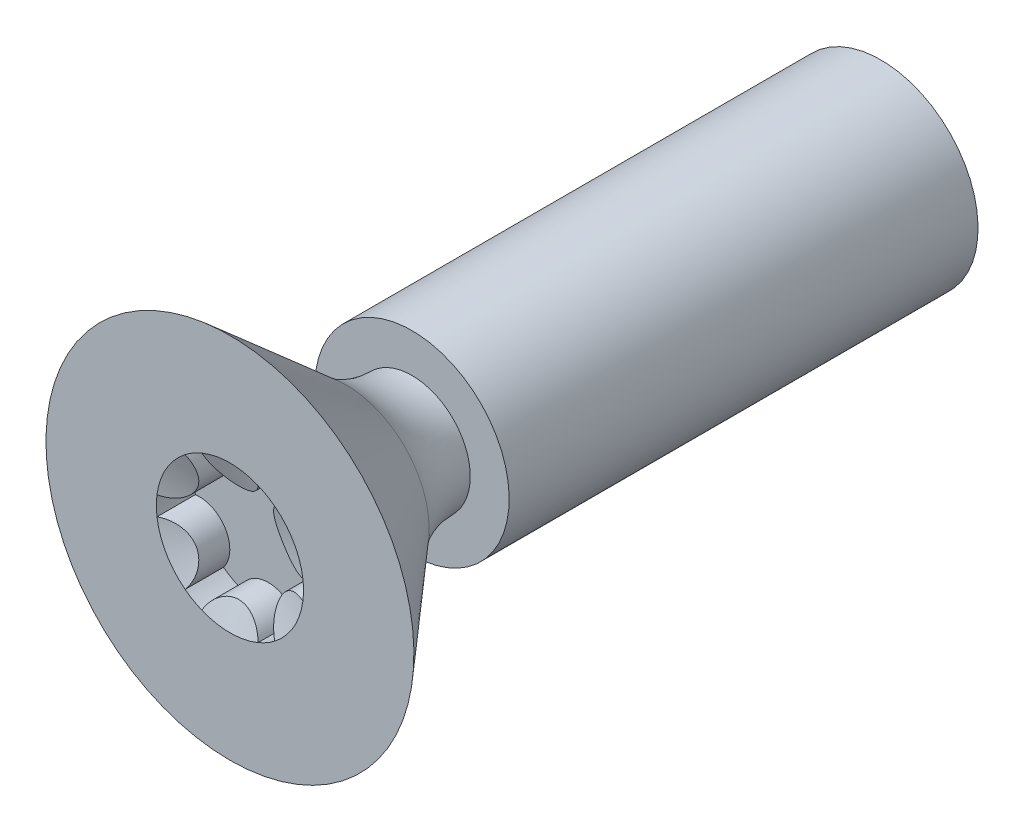
ISO-10303-21;
HEADER;
FILE_DESCRIPTION(('STEP AP214'),'2;1');
FILE_NAME('part.step','',(''),(''),'','','');
FILE_SCHEMA(('AUTOMOTIVE_DESIGN { 1 0 10303 214 1 1 1 1 }'));
ENDSEC;
DATA;
#1=APPLICATION_CONTEXT('core data for automotive mechanical design processes');
#2=APPLICATION_PROTOCOL_DEFINITION('international standard','automotive_design',2000,#1);
#3=PRODUCT_CONTEXT('',#1,'mechanical');
#4=PRODUCT('Part','Part','',(#3));
#5=PRODUCT_RELATED_PRODUCT_CATEGORY('part','',(#4));
#6=PRODUCT_DEFINITION_FORMATION('','',#4);
#7=PRODUCT_DEFINITION_CONTEXT('part definition',#1,'design');
#8=PRODUCT_DEFINITION('design','',#6,#7);
#9=PRODUCT_DEFINITION_SHAPE('','',#8);
#10=(LENGTH_UNIT() NAMED_UNIT(*) SI_UNIT(.MILLI.,.METRE.));
#11=(NAMED_UNIT(*) PLANE_ANGLE_UNIT() SI_UNIT($,.RADIAN.));
#12=(NAMED_UNIT(*) SI_UNIT($,.STERADIAN.) SOLID_ANGLE_UNIT());
#13=UNCERTAINTY_MEASURE_WITH_UNIT(LENGTH_MEASURE(1.E-05),#10,'distance_accuracy_value','');
#14=(GEOMETRIC_REPRESENTATION_CONTEXT(3) GLOBAL_UNCERTAINTY_ASSIGNED_CONTEXT((#13)) GLOBAL_UNIT_ASSIGNED_CONTEXT((#10,
#11,#12)) REPRESENTATION_CONTEXT('',''));
#15=CARTESIAN_POINT('',(0.,0.,0.));
#16=DIRECTION('',(0.,0.,1.));
#17=DIRECTION('',(1.,0.,0.));
#18=AXIS2_PLACEMENT_3D('',#15,#16,#17);
#19=CARTESIAN_POINT('',(0.,0.,-4.7625));
#20=DIRECTION('',(0.,0.,1.));
#21=DIRECTION('',(0.,-1.,0.));
#22=AXIS2_PLACEMENT_3D('',#19,#20,#21);
#23=PLANE('',#22);
#24=CARTESIAN_POINT('',(0.,0.,-4.7625));
#25=DIRECTION('',(0.,0.,1.));
#26=DIRECTION('',(0.,-1.,0.));
#27=AXIS2_PLACEMENT_3D('',#24,#25,#26);
#28=CIRCLE('',#27,1.4224);
#29=CARTESIAN_POINT('',(0.,-1.4224,-4.7625));
#30=VERTEX_POINT('',#29);
#31=EDGE_CURVE('E55',#30,#30,#28,.T.);
#32=ORIENTED_EDGE('',*,*,#31,.F.);
#33=EDGE_LOOP('',(#32));
#34=FACE_BOUND('',#33,.T.);
#35=ADVANCED_FACE('F41',(#34),#23,.F.);
#36=CARTESIAN_POINT('',(0.,0.,4.7625));
#37=DIRECTION('',(0.,0.,1.));
#38=DIRECTION('',(0.,-1.,0.));
#39=AXIS2_PLACEMENT_3D('',#36,#37,#38);
#40=CYLINDRICAL_SURFACE('',#39,1.4224);
#41=CARTESIAN_POINT('',(0.,0.,2.09888516960932));
#42=DIRECTION('',(0.,0.,1.));
#43=DIRECTION('',(0.,-1.,0.));
#44=AXIS2_PLACEMENT_3D('',#41,#42,#43);
#45=CIRCLE('',#44,1.4224);
#46=CARTESIAN_POINT('',(0.,-1.4224,2.09888516960932));
#47=VERTEX_POINT('',#46);
#48=EDGE_CURVE('E203',#47,#47,#45,.T.);
#49=ORIENTED_EDGE('',*,*,#48,.F.);
#50=EDGE_LOOP('',(#49));
#51=FACE_BOUND('',#50,.T.);
#52=ORIENTED_EDGE('',*,*,#31,.T.);
#53=EDGE_LOOP('',(#52));
#54=FACE_BOUND('',#53,.T.);
#55=ADVANCED_FACE('F208',(#51,#54),#40,.T.);
#56=CARTESIAN_POINT('',(0.,1.4224,2.09888516960932));
#57=DIRECTION('',(0.,0.,-1.));
#58=DIRECTION('',(0.,1.,0.));
#59=AXIS2_PLACEMENT_3D('',#56,#57,#58);
#60=PLANE('',#59);
#61=CARTESIAN_POINT('',(0.,0.,2.09888516960932));
#62=DIRECTION('',(0.,0.,1.));
#63=DIRECTION('',(0.,-1.,0.));
#64=AXIS2_PLACEMENT_3D('',#61,#62,#63);
#65=CIRCLE('',#64,0.853440000000002);
#66=CARTESIAN_POINT('',(0.,-0.853440000000003,2.09888516960932));
#67=VERTEX_POINT('',#66);
#68=EDGE_CURVE('E200',#67,#67,#65,.T.);
#69=ORIENTED_EDGE('',*,*,#68,.F.);
#70=EDGE_LOOP('',(#69));
#71=FACE_BOUND('',#70,.T.);
#72=ORIENTED_EDGE('',*,*,#48,.T.);
#73=EDGE_LOOP('',(#72));
#74=FACE_BOUND('',#73,.T.);
#75=ADVANCED_FACE('F214',(#71,#74),#60,.F.);
#76=CARTESIAN_POINT('',(0.,0.,2.09888516960932));
#77=DIRECTION('',(0.,0.,1.));
#78=DIRECTION('',(0.,-1.,0.));
#79=AXIS2_PLACEMENT_3D('',#76,#77,#78);
#80=TOROIDAL_SURFACE('',#79,2.31948922406243,1.46604922406243);
#81=CARTESIAN_POINT('',(0.,0.,3.0607));
#82=DIRECTION('',(0.,0.,1.));
#83=DIRECTION('',(0.,-1.,0.));
#84=AXIS2_PLACEMENT_3D('',#81,#82,#83);
#85=CIRCLE('',#84,1.21304782958435);
#86=CARTESIAN_POINT('',(0.,-1.21304782958435,3.0607));
#87=VERTEX_POINT('',#86);
#88=EDGE_CURVE('E197',#87,#87,#85,.T.);
#89=ORIENTED_EDGE('',*,*,#88,.F.);
#90=EDGE_LOOP('',(#89));
#91=FACE_BOUND('',#90,.T.);
#92=ORIENTED_EDGE('',*,*,#68,.T.);
#93=EDGE_LOOP('',(#92));
#94=FACE_BOUND('',#93,.T.);
#95=ADVANCED_FACE('F219',(#91,#94),#80,.F.);
#96=CARTESIAN_POINT('',(0.,0.,3.0607));
#97=DIRECTION('',(0.,0.,1.));
#98=DIRECTION('',(0.,-1.,0.));
#99=AXIS2_PLACEMENT_3D('',#96,#97,#98);
#100=CONICAL_SURFACE('',#99,1.21304782958435,0.715584993317673);
#101=CARTESIAN_POINT('',(0.,0.,4.7625));
#102=DIRECTION('',(0.,0.,1.));
#103=DIRECTION('',(0.,-1.,0.));
#104=AXIS2_PLACEMENT_3D('',#101,#102,#103);
#105=CIRCLE('',#104,2.6924);
#106=CARTESIAN_POINT('',(0.,-2.6924,4.7625));
#107=VERTEX_POINT('',#106);
#108=EDGE_CURVE('E192',#107,#107,#105,.T.);
#109=ORIENTED_EDGE('',*,*,#108,.F.);
#110=EDGE_LOOP('',(#109));
#111=FACE_BOUND('',#110,.T.);
#112=ORIENTED_EDGE('',*,*,#88,.T.);
#113=EDGE_LOOP('',(#112));
#114=FACE_BOUND('',#113,.T.);
#115=ADVANCED_FACE('F226',(#111,#114),#100,.T.);
#116=CARTESIAN_POINT('',(0.,2.6924,4.7625));
#117=DIRECTION('',(0.,0.,-1.));
#118=DIRECTION('',(0.,1.,0.));
#119=AXIS2_PLACEMENT_3D('',#116,#117,#118);
#120=PLANE('',#119);
#121=CARTESIAN_POINT('',(0.,0.,4.7625));
#122=DIRECTION('',(0.,0.,1.));
#123=DIRECTION('',(1.,0.,0.));
#124=AXIS2_PLACEMENT_3D('',#121,#122,#123);
#125=CIRCLE('',#124,1.07696);
#126=CARTESIAN_POINT('',(0.655611708585233,0.854409813360048,4.7625));
#127=VERTEX_POINT('',#126);
#128=CARTESIAN_POINT('',(0.412134749319907,0.994981301333356,4.7625));
#129=VERTEX_POINT('',#128);
#130=EDGE_CURVE('E151',#127,#129,#125,.T.);
#131=ORIENTED_EDGE('',*,*,#130,.F.);
#132=CARTESIAN_POINT('',(0.,0.,4.7625));
#133=DIRECTION('',(0.,0.,1.));
#134=DIRECTION('',(1.,0.,0.));
#135=AXIS2_PLACEMENT_3D('',#132,#133,#134);
#136=CIRCLE('',#135,1.07696);
#137=CARTESIAN_POINT('',(1.06774645790514,0.140571487973304,4.7625));
#138=VERTEX_POINT('',#137);
#139=EDGE_CURVE('E134',#138,#127,#136,.T.);
#140=ORIENTED_EDGE('',*,*,#139,.F.);
#141=CARTESIAN_POINT('',(0.,0.,4.7625));
#142=DIRECTION('',(0.,0.,1.));
#143=DIRECTION('',(0.499999999999998,-0.86602540378444,0.));
#144=AXIS2_PLACEMENT_3D('',#141,#142,#143);
#145=CIRCLE('',#144,1.07696);
#146=CARTESIAN_POINT('',(1.06774645790514,-0.140571487973311,4.7625));
#147=VERTEX_POINT('',#146);
#148=EDGE_CURVE('E148',#147,#138,#145,.T.);
#149=ORIENTED_EDGE('',*,*,#148,.F.);
#150=CARTESIAN_POINT('',(0.655611708585228,-0.854409813360052,4.7625));
#151=VERTEX_POINT('',#150);
#152=EDGE_CURVE('E156',#151,#147,#136,.T.);
#153=ORIENTED_EDGE('',*,*,#152,.F.);
#154=CARTESIAN_POINT('',(0.,0.,4.7625));
#155=DIRECTION('',(0.,0.,1.));
#156=DIRECTION('',(-0.500000000000004,-0.866025403784436,0.));
#157=AXIS2_PLACEMENT_3D('',#154,#155,#156);
#158=CIRCLE('',#157,1.07696);
#159=CARTESIAN_POINT('',(0.412134749319908,-0.994981301333355,4.7625));
#160=VERTEX_POINT('',#159);
#161=EDGE_CURVE('E318',#160,#151,#158,.T.);
#162=ORIENTED_EDGE('',*,*,#161,.F.);
#163=CARTESIAN_POINT('',(-0.412134749319907,-0.994981301333356,4.7625));
#164=VERTEX_POINT('',#163);
#165=EDGE_CURVE('E319',#164,#160,#136,.T.);
#166=ORIENTED_EDGE('',*,*,#165,.F.);
#167=CARTESIAN_POINT('',(0.,0.,4.7625));
#168=DIRECTION('',(0.,0.,1.));
#169=DIRECTION('',(-1.,0.,0.));
#170=AXIS2_PLACEMENT_3D('',#167,#168,#169);
#171=CIRCLE('',#170,1.07696);
#172=CARTESIAN_POINT('',(-0.655611708585239,-0.854409813360043,4.7625));
#173=VERTEX_POINT('',#172);
#174=EDGE_CURVE('E353',#173,#164,#171,.T.);
#175=ORIENTED_EDGE('',*,*,#174,.F.);
#176=CARTESIAN_POINT('',(-1.06774645790514,-0.140571487973297,4.7625));
#177=VERTEX_POINT('',#176);
#178=EDGE_CURVE('E320',#177,#173,#136,.T.);
#179=ORIENTED_EDGE('',*,*,#178,.F.);
#180=CARTESIAN_POINT('',(0.,0.,4.7625));
#181=DIRECTION('',(0.,0.,1.));
#182=DIRECTION('',(-0.499999999999992,0.866025403784443,0.));
#183=AXIS2_PLACEMENT_3D('',#180,#181,#182);
#184=CIRCLE('',#183,1.07696);
#185=CARTESIAN_POINT('',(-1.06774645790514,0.140571487973318,4.7625));
#186=VERTEX_POINT('',#185);
#187=EDGE_CURVE('E336',#186,#177,#184,.T.);
#188=ORIENTED_EDGE('',*,*,#187,.F.);
#189=CARTESIAN_POINT('',(-0.655611708585222,0.854409813360056,4.7625));
#190=VERTEX_POINT('',#189);
#191=EDGE_CURVE('E323',#190,#186,#136,.T.);
#192=ORIENTED_EDGE('',*,*,#191,.F.);
#193=CARTESIAN_POINT('',(0.,0.,4.7625));
#194=DIRECTION('',(0.,0.,1.));
#195=DIRECTION('',(1.,0.,0.));
#196=AXIS2_PLACEMENT_3D('',#193,#194,#195);
#197=CIRCLE('',#196,1.07696);
#198=CARTESIAN_POINT('',(-0.412134749319908,0.994981301333355,4.7625));
#199=VERTEX_POINT('',#198);
#200=EDGE_CURVE('E182',#199,#190,#197,.T.);
#201=ORIENTED_EDGE('',*,*,#200,.F.);
#202=EDGE_CURVE('E154',#129,#199,#136,.T.);
#203=ORIENTED_EDGE('',*,*,#202,.F.);
#204=EDGE_LOOP('',(#131,#140,#149,#153,#162,#166,#175,#179,#188,#192,#201,#203));
#205=FACE_BOUND('',#204,.T.);
#206=ORIENTED_EDGE('',*,*,#108,.T.);
#207=EDGE_LOOP('',(#206));
#208=FACE_BOUND('',#207,.T.);
#209=ADVANCED_FACE('F144',(#205,#208),#120,.F.);
#210=CARTESIAN_POINT('',(0.,0.,4.200906));
#211=DIRECTION('',(0.,0.,1.));
#212=DIRECTION('',(1.,0.,0.));
#213=AXIS2_PLACEMENT_3D('',#210,#211,#212);
#214=CYLINDRICAL_SURFACE('',#213,1.07696);
#215=ORIENTED_EDGE('',*,*,#200,.T.);
#216=DIRECTION('',(0.,0.,1.));
#217=VECTOR('',#216,1.);
#218=CARTESIAN_POINT('',(-0.655611708585222,0.854409813360056,4.200906));
#219=LINE('',#218,#217);
#220=CARTESIAN_POINT('',(-0.655611708585222,0.854409813360056,4.200906));
#221=VERTEX_POINT('',#220);
#222=EDGE_CURVE('E347',#221,#190,#219,.T.);
#223=ORIENTED_EDGE('',*,*,#222,.F.);
#224=CARTESIAN_POINT('',(0.,0.,4.200906));
#225=DIRECTION('',(0.,0.,1.));
#226=DIRECTION('',(1.,0.,0.));
#227=AXIS2_PLACEMENT_3D('',#224,#225,#226);
#228=CIRCLE('',#227,1.07696);
#229=CARTESIAN_POINT('',(-0.412134749319908,0.994981301333355,4.200906));
#230=VERTEX_POINT('',#229);
#231=EDGE_CURVE('E185',#230,#221,#228,.T.);
#232=ORIENTED_EDGE('',*,*,#231,.F.);
#233=DIRECTION('',(0.,0.,1.));
#234=VECTOR('',#233,1.);
#235=CARTESIAN_POINT('',(-0.412134749319908,0.994981301333355,4.200906));
#236=LINE('',#235,#234);
#237=EDGE_CURVE('E62',#230,#199,#236,.T.);
#238=ORIENTED_EDGE('',*,*,#237,.T.);
#239=EDGE_LOOP('',(#215,#223,#232,#238));
#240=FACE_BOUND('',#239,.T.);
#241=ADVANCED_FACE('F233',(#240),#214,.F.);
#242=CARTESIAN_POINT('',(0.,1.1656931040269,4.200906));
#243=DIRECTION('',(0.,0.,1.));
#244=DIRECTION('',(1.,0.,0.));
#245=AXIS2_PLACEMENT_3D('',#242,#243,#244);
#246=CYLINDRICAL_SURFACE('',#245,0.446091438133329);
#247=DIRECTION('',(0.,0.,1.));
#248=VECTOR('',#247,1.);
#249=CARTESIAN_POINT('',(0.412134749319907,0.994981301333355,4.200906));
#250=LINE('',#249,#248);
#251=CARTESIAN_POINT('',(0.412134749319907,0.994981301333355,4.200906));
#252=VERTEX_POINT('',#251);
#253=EDGE_CURVE('E187',#252,#129,#250,.T.);
#254=ORIENTED_EDGE('',*,*,#253,.T.);
#255=CARTESIAN_POINT('',(0.412217535189932,0.995181301333363,4.76257878379122));
#256=CARTESIAN_POINT('',(0.402218532584292,0.970978856009884,4.75306377677122));
#257=CARTESIAN_POINT('',(0.390069787174501,0.947669824303697,4.74351891366794));
#258=CARTESIAN_POINT('',(0.361780712977006,0.903392429802186,4.72470411475033));
#259=CARTESIAN_POINT('',(0.345629774957911,0.882430506814702,4.71543498421686));
#260=CARTESIAN_POINT('',(0.309679984041634,0.843514203319636,4.69755045217848));
#261=CARTESIAN_POINT('',(0.289876786592517,0.82556345383982,4.68893584668143));
#262=CARTESIAN_POINT('',(0.247080771537108,0.793315302332872,4.67289120388156));
#263=CARTESIAN_POINT('',(0.224090675265836,0.779014812594221,4.66546016742611));
#264=CARTESIAN_POINT('',(0.176713064753171,0.755283841482144,4.65275566684374));
#265=CARTESIAN_POINT('',(0.152456468355724,0.745642319957259,4.64739154992137));
#266=CARTESIAN_POINT('',(0.102273448420043,0.730698298567651,4.63892957349096));
#267=CARTESIAN_POINT('',(0.0763492624458178,0.725390110068896,4.63582874339494));
#268=CARTESIAN_POINT('',(0.0270471068895947,0.719818940453361,4.63256478463054));
#269=CARTESIAN_POINT('',(0.00375046947984284,0.71901346298047,4.6320859263302));
#270=CARTESIAN_POINT('',(-0.0426261801452408,0.721037250446202,4.6332778592215));
#271=CARTESIAN_POINT('',(-0.0657062300058927,0.723865871493425,4.63494826960471));
#272=CARTESIAN_POINT('',(-0.109487556319788,0.732706386386486,4.64005874354336));
#273=CARTESIAN_POINT('',(-0.130246890731964,0.738505190424075,4.64337995243548));
#274=CARTESIAN_POINT('',(-0.170477358946198,0.752907678496629,4.65141229574263));
#275=CARTESIAN_POINT('',(-0.189948239915114,0.761511911088823,4.65612370197164));
#276=CARTESIAN_POINT('',(-0.228759760915408,0.782043850090003,4.66702461342053));
#277=CARTESIAN_POINT('',(-0.247962722776532,0.794183940675942,4.67330279790926));
#278=CARTESIAN_POINT('',(-0.284136023529871,0.821058978826113,4.68671274588709));
#279=CARTESIAN_POINT('',(-0.301104417812656,0.835796160747644,4.69384524266095));
#280=CARTESIAN_POINT('',(-0.334388855623221,0.869374807430502,4.70952366364388));
#281=CARTESIAN_POINT('',(-0.350391677575767,0.88849537385316,4.71813706078043));
#282=CARTESIAN_POINT('',(-0.378924549806628,0.928995777520554,4.73568513890219));
#283=CARTESIAN_POINT('',(-0.391460272419411,0.950371844535248,4.74461926776797));
#284=CARTESIAN_POINT('',(-0.405706120214104,0.980035972287522,4.75657927085055));
#285=CARTESIAN_POINT('',(-0.409068533600499,0.98756633153689,4.75958004824173));
#286=CARTESIAN_POINT('',(-0.412217535189934,0.995181301333363,4.76257878379122));
#287=B_SPLINE_CURVE_WITH_KNOTS('',3,(#255,#256,#257,#258,#259,#260,#261,#262,#263,#264,#265,
#266,#267,#268,#269,#270,#271,#272,#273,#274,#275,#276,#277,#278,#279,#280,#281,#282,#283,#284,
#285,#286),.UNSPECIFIED.,.F.,.F.,(4,2,2,2,2,2,2,2,2,2,2,2,2,2,2,4),(0.,0.0835011768916914,
0.167226116630064,0.251051301543926,0.33480534297495,0.414291234869104,0.493672612159344,
0.563242414916322,0.632799892960467,0.697949380928842,0.763111615497498,0.8335396810455,
0.90402863648471,0.982834929381848,1.06151151843471,1.08782618491492),.UNSPECIFIED.);
#288=EDGE_CURVE('E139',#129,#199,#287,.T.);
#289=ORIENTED_EDGE('',*,*,#288,.T.);
#290=ORIENTED_EDGE('',*,*,#237,.F.);
#291=CARTESIAN_POINT('',(0.,1.1656931040269,4.200906));
#292=DIRECTION('',(0.,0.,-1.));
#293=DIRECTION('',(1.,0.,0.));
#294=AXIS2_PLACEMENT_3D('',#291,#292,#293);
#295=CIRCLE('',#294,0.446091438133329);
#296=EDGE_CURVE('E181',#252,#230,#295,.T.);
#297=ORIENTED_EDGE('',*,*,#296,.F.);
#298=EDGE_LOOP('',(#254,#289,#290,#297));
#299=FACE_BOUND('',#298,.T.);
#300=ADVANCED_FACE('F238',(#299),#246,.T.);
#301=CARTESIAN_POINT('',(0.,0.,4.200906));
#302=DIRECTION('',(0.,0.,1.));
#303=DIRECTION('',(1.,0.,0.));
#304=AXIS2_PLACEMENT_3D('',#301,#302,#303);
#305=CYLINDRICAL_SURFACE('',#304,1.07696);
#306=ORIENTED_EDGE('',*,*,#130,.T.);
#307=ORIENTED_EDGE('',*,*,#253,.F.);
#308=CARTESIAN_POINT('',(0.,0.,4.200906));
#309=DIRECTION('',(0.,0.,1.));
#310=DIRECTION('',(1.,0.,0.));
#311=AXIS2_PLACEMENT_3D('',#308,#309,#310);
#312=CIRCLE('',#311,1.07696);
#313=CARTESIAN_POINT('',(0.655611708585233,0.854409813360048,4.200906));
#314=VERTEX_POINT('',#313);
#315=EDGE_CURVE('E178',#314,#252,#312,.T.);
#316=ORIENTED_EDGE('',*,*,#315,.F.);
#317=DIRECTION('',(0.,0.,1.));
#318=VECTOR('',#317,1.);
#319=CARTESIAN_POINT('',(0.655611708585233,0.854409813360048,4.200906));
#320=LINE('',#319,#318);
#321=EDGE_CURVE('E164',#314,#127,#320,.T.);
#322=ORIENTED_EDGE('',*,*,#321,.T.);
#323=EDGE_LOOP('',(#306,#307,#316,#322));
#324=FACE_BOUND('',#323,.T.);
#325=ADVANCED_FACE('F234',(#324),#305,.F.);
#326=CARTESIAN_POINT('',(0.,0.,4.200906));
#327=DIRECTION('',(0.,0.,1.));
#328=DIRECTION('',(1.,0.,0.));
#329=AXIS2_PLACEMENT_3D('',#326,#327,#328);
#330=PLANE('',#329);
#331=CARTESIAN_POINT('',(1.00951984110363,0.582846552013447,4.200906));
#332=DIRECTION('',(0.,0.,-1.));
#333=DIRECTION('',(0.499999999999998,-0.86602540378444,0.));
#334=AXIS2_PLACEMENT_3D('',#331,#332,#333);
#335=CIRCLE('',#334,0.446091438133329);
#336=CARTESIAN_POINT('',(1.06774645790514,0.140571487973304,4.200906));
#337=VERTEX_POINT('',#336);
#338=EDGE_CURVE('E161',#337,#314,#335,.T.);
#339=ORIENTED_EDGE('',*,*,#338,.T.);
#340=ORIENTED_EDGE('',*,*,#315,.T.);
#341=ORIENTED_EDGE('',*,*,#296,.T.);
#342=ORIENTED_EDGE('',*,*,#231,.T.);
#343=CARTESIAN_POINT('',(-1.00951984110362,0.58284655201346,4.200906));
#344=DIRECTION('',(0.,0.,-1.));
#345=DIRECTION('',(0.50000000000001,0.866025403784433,0.));
#346=AXIS2_PLACEMENT_3D('',#343,#344,#345);
#347=CIRCLE('',#346,0.446091438133329);
#348=CARTESIAN_POINT('',(-1.06774645790514,0.140571487973318,4.200906));
#349=VERTEX_POINT('',#348);
#350=EDGE_CURVE('E250',#221,#349,#347,.T.);
#351=ORIENTED_EDGE('',*,*,#350,.T.);
#352=CARTESIAN_POINT('',(0.,0.,4.200906));
#353=DIRECTION('',(0.,0.,1.));
#354=DIRECTION('',(-0.499999999999992,0.866025403784443,0.));
#355=AXIS2_PLACEMENT_3D('',#352,#353,#354);
#356=CIRCLE('',#355,1.07696);
#357=CARTESIAN_POINT('',(-1.06774645790514,-0.140571487973297,4.200906));
#358=VERTEX_POINT('',#357);
#359=EDGE_CURVE('E341',#349,#358,#356,.T.);
#360=ORIENTED_EDGE('',*,*,#359,.T.);
#361=CARTESIAN_POINT('',(-1.00951984110363,-0.58284655201344,4.200906));
#362=DIRECTION('',(0.,0.,-1.));
#363=DIRECTION('',(-0.499999999999992,0.866025403784443,0.));
#364=AXIS2_PLACEMENT_3D('',#361,#362,#363);
#365=CIRCLE('',#364,0.446091438133329);
#366=CARTESIAN_POINT('',(-0.655611708585239,-0.854409813360043,4.200906));
#367=VERTEX_POINT('',#366);
#368=EDGE_CURVE('E345',#358,#367,#365,.T.);
#369=ORIENTED_EDGE('',*,*,#368,.T.);
#370=CARTESIAN_POINT('',(0.,0.,4.200906));
#371=DIRECTION('',(0.,0.,1.));
#372=DIRECTION('',(-1.,0.,0.));
#373=AXIS2_PLACEMENT_3D('',#370,#371,#372);
#374=CIRCLE('',#373,1.07696);
#375=CARTESIAN_POINT('',(-0.412134749319907,-0.994981301333355,4.200906));
#376=VERTEX_POINT('',#375);
#377=EDGE_CURVE('E356',#367,#376,#374,.T.);
#378=ORIENTED_EDGE('',*,*,#377,.T.);
#379=CARTESIAN_POINT('',(0.,-1.1656931040269,4.200906));
#380=DIRECTION('',(0.,0.,-1.));
#381=DIRECTION('',(-1.,0.,0.));
#382=AXIS2_PLACEMENT_3D('',#379,#380,#381);
#383=CIRCLE('',#382,0.446091438133329);
#384=CARTESIAN_POINT('',(0.412134749319908,-0.994981301333355,4.200906));
#385=VERTEX_POINT('',#384);
#386=EDGE_CURVE('E359',#376,#385,#383,.T.);
#387=ORIENTED_EDGE('',*,*,#386,.T.);
#388=CARTESIAN_POINT('',(0.,0.,4.200906));
#389=DIRECTION('',(0.,0.,1.));
#390=DIRECTION('',(-0.500000000000004,-0.866025403784436,0.));
#391=AXIS2_PLACEMENT_3D('',#388,#389,#390);
#392=CIRCLE('',#391,1.07696);
#393=CARTESIAN_POINT('',(0.655611708585228,-0.854409813360052,4.200906));
#394=VERTEX_POINT('',#393);
#395=EDGE_CURVE('E370',#385,#394,#392,.T.);
#396=ORIENTED_EDGE('',*,*,#395,.T.);
#397=CARTESIAN_POINT('',(1.00951984110363,-0.582846552013453,4.200906));
#398=DIRECTION('',(0.,0.,-1.));
#399=DIRECTION('',(-0.500000000000004,-0.866025403784436,0.));
#400=AXIS2_PLACEMENT_3D('',#397,#398,#399);
#401=CIRCLE('',#400,0.446091438133329);
#402=CARTESIAN_POINT('',(1.06774645790514,-0.140571487973311,4.200906));
#403=VERTEX_POINT('',#402);
#404=EDGE_CURVE('E311',#394,#403,#401,.T.);
#405=ORIENTED_EDGE('',*,*,#404,.T.);
#406=CARTESIAN_POINT('',(0.,0.,4.200906));
#407=DIRECTION('',(0.,0.,1.));
#408=DIRECTION('',(0.499999999999998,-0.86602540378444,0.));
#409=AXIS2_PLACEMENT_3D('',#406,#407,#408);
#410=CIRCLE('',#409,1.07696);
#411=EDGE_CURVE('E170',#403,#337,#410,.T.);
#412=ORIENTED_EDGE('',*,*,#411,.T.);
#413=EDGE_LOOP('',(#339,#340,#341,#342,#351,#360,#369,#378,#387,#396,#405,#412));
#414=FACE_BOUND('',#413,.T.);
#415=ADVANCED_FACE('F237',(#414),#330,.T.);
#416=CARTESIAN_POINT('',(1.00951984110363,0.582846552013447,4.200906));
#417=DIRECTION('',(0.,0.,1.));
#418=DIRECTION('',(1.,0.,0.));
#419=AXIS2_PLACEMENT_3D('',#416,#417,#418);
#420=CYLINDRICAL_SURFACE('',#419,0.446091438133329);
#421=DIRECTION('',(0.,0.,1.));
#422=VECTOR('',#421,1.);
#423=CARTESIAN_POINT('',(1.06774645790514,0.140571487973304,4.200906));
#424=LINE('',#423,#422);
#425=EDGE_CURVE('E158',#337,#138,#424,.T.);
#426=ORIENTED_EDGE('',*,*,#425,.T.);
#427=CARTESIAN_POINT('',(1.06794645790514,0.140597864480073,4.76257342436951));
#428=CARTESIAN_POINT('',(1.0419870198108,0.137156903808665,4.75305845784469));
#429=CARTESIAN_POINT('',(1.01572649723712,0.136024370427879,4.74351365798389));
#430=CARTESIAN_POINT('',(0.963236856382313,0.138386419626026,4.72469904050315));
#431=CARTESIAN_POINT('',(0.937008010910264,0.141893411870822,4.71543002845079));
#432=CARTESIAN_POINT('',(0.885331089012054,0.153570315168539,4.6975458053512));
#433=CARTESIAN_POINT('',(0.859883985138949,0.161745804871025,4.6889313904983));
#434=CARTESIAN_POINT('',(0.810558986388017,0.182685695571367,4.67288722372097));
#435=CARTESIAN_POINT('',(0.786679777731734,0.195446195105916,4.66545647233255));
#436=CARTESIAN_POINT('',(0.742440426279592,0.22461220479501,4.65275266671022));
#437=CARTESIAN_POINT('',(0.721962958089376,0.240798798794242,4.64738894526767));
#438=CARTESIAN_POINT('',(0.683930895704958,0.276787459278119,4.63892781850148));
#439=CARTESIAN_POINT('',(0.666372493733785,0.296584743926223,4.63582744255509));
#440=CARTESIAN_POINT('',(0.636898066295452,0.33649656190161,4.63256433751379));
#441=CARTESIAN_POINT('',(0.624552878991043,0.356269428534179,4.63208587440746));
#442=CARTESIAN_POINT('',(0.603118577567221,0.397444772762326,4.63327853322926));
#443=CARTESIAN_POINT('',(0.594028887374358,0.418846961229223,4.63494927460643));
#444=CARTESIAN_POINT('',(0.579795498616561,0.461183032826544,4.64006032802165));
#445=CARTESIAN_POINT('',(0.574438272675969,0.482060669070351,4.64338181302144));
#446=CARTESIAN_POINT('',(0.566797021813467,0.52410268317885,4.65141465381128));
#447=CARTESIAN_POINT('',(0.564513598463478,0.54526711635398,4.65612628144533));
#448=CARTESIAN_POINT('',(0.562890111667022,0.589145052048377,4.6670276454071));
#449=CARTESIAN_POINT('',(0.56380284668153,0.611845506362739,4.67330606696333));
#450=CARTESIAN_POINT('',(0.568991878426509,0.656610244451043,4.68671644490775));
#451=CARTESIAN_POINT('',(0.573271082083871,0.67867396132832,4.6938491344369));
#452=CARTESIAN_POINT('',(0.585710169356141,0.724288446915928,4.70952790521994));
#453=CARTESIAN_POINT('',(0.594268368370634,0.74770750002312,4.71814145312157));
#454=CARTESIAN_POINT('',(0.615077746169878,0.792667622895215,4.73568978825504));
#455=CARTESIAN_POINT('',(0.627322825665854,0.814211719140461,4.74462402362899));
#456=CARTESIAN_POINT('',(0.645894926147466,0.841386822500592,4.75658683379995));
#457=CARTESIAN_POINT('',(0.650739946248591,0.84806971006797,4.7595903299764));
#458=CARTESIAN_POINT('',(0.655765263796742,0.854609813346334,4.76259177478417));
#459=B_SPLINE_CURVE_WITH_KNOTS('',3,(#427,#428,#429,#430,#431,#432,#433,#434,#435,#436,#437,
#438,#439,#440,#441,#442,#443,#444,#445,#446,#447,#448,#449,#450,#451,#452,#453,#454,#455,#456,
#457,#458),.UNSPECIFIED.,.F.,.F.,(4,2,2,2,2,2,2,2,2,2,2,2,2,2,2,4),(0.,0.0835008294128591,
0.167225456561838,0.25105034095401,0.334804065582383,0.414289219499643,0.493669861304818,
0.563238866404968,0.632795554897446,0.697945136265738,0.763107466163767,0.833536236880948,
0.904025889288688,0.982832800048652,1.06151004848508,1.0878484953377),.UNSPECIFIED.);
#460=EDGE_CURVE('E131',#138,#127,#459,.T.);
#461=ORIENTED_EDGE('',*,*,#460,.T.);
#462=ORIENTED_EDGE('',*,*,#321,.F.);
#463=ORIENTED_EDGE('',*,*,#338,.F.);
#464=EDGE_LOOP('',(#426,#461,#462,#463));
#465=FACE_BOUND('',#464,.T.);
#466=ADVANCED_FACE('F159',(#465),#420,.T.);
#467=CARTESIAN_POINT('',(0.,0.,4.200906));
#468=DIRECTION('',(0.,0.,1.));
#469=DIRECTION('',(1.,0.,0.));
#470=AXIS2_PLACEMENT_3D('',#467,#468,#469);
#471=CYLINDRICAL_SURFACE('',#470,1.07696);
#472=ORIENTED_EDGE('',*,*,#148,.T.);
#473=ORIENTED_EDGE('',*,*,#425,.F.);
#474=ORIENTED_EDGE('',*,*,#411,.F.);
#475=DIRECTION('',(0.,0.,1.));
#476=VECTOR('',#475,1.);
#477=CARTESIAN_POINT('',(1.06774645790514,-0.140571487973311,4.200906));
#478=LINE('',#477,#476);
#479=EDGE_CURVE('E169',#403,#147,#478,.T.);
#480=ORIENTED_EDGE('',*,*,#479,.T.);
#481=EDGE_LOOP('',(#472,#473,#474,#480));
#482=FACE_BOUND('',#481,.T.);
#483=ADVANCED_FACE('F167',(#482),#471,.F.);
#484=CARTESIAN_POINT('',(1.00951984110363,-0.582846552013453,4.200906));
#485=DIRECTION('',(0.,0.,1.));
#486=DIRECTION('',(0.,-1.,0.));
#487=AXIS2_PLACEMENT_3D('',#484,#485,#486);
#488=CYLINDRICAL_SURFACE('',#487,0.446091438133329);
#489=DIRECTION('',(0.,0.,1.));
#490=VECTOR('',#489,1.);
#491=CARTESIAN_POINT('',(0.655611708585228,-0.854409813360052,4.200906));
#492=LINE('',#491,#490);
#493=EDGE_CURVE('E173',#394,#151,#492,.T.);
#494=ORIENTED_EDGE('',*,*,#493,.T.);
#495=CARTESIAN_POINT('',(0.655765263796738,-0.854609813346337,4.76259177478417));
#496=CARTESIAN_POINT('',(0.639803007982871,-0.833850266104216,4.75307666966103));
#497=CARTESIAN_POINT('',(0.625689283916424,-0.811675537161665,4.74353165331887));
#498=CARTESIAN_POINT('',(0.601484629397532,-0.765039317347505,4.72471641474202));
#499=CARTESIAN_POINT('',(0.59140457613841,-0.740571860006172,4.71544699709301));
#500=CARTESIAN_POINT('',(0.575672974519262,-0.689981233539063,4.69756171635604));
#501=CARTESIAN_POINT('',(0.570026741326349,-0.663856117653794,4.68894664882444));
#502=CARTESIAN_POINT('',(0.563492936752706,-0.610669934076368,4.67290085232468));
#503=CARTESIAN_POINT('',(0.562601332975101,-0.583609679087525,4.6654691249587));
#504=CARTESIAN_POINT('',(0.565734519140334,-0.530713269943585,4.65276293996084));
#505=CARTESIAN_POINT('',(0.569511143641453,-0.504884990361241,4.64739786446445));
#506=CARTESIAN_POINT('',(0.581657223767206,-0.453951468562531,4.63893382851979));
#507=CARTESIAN_POINT('',(0.590020633629591,-0.428845320263515,4.63583189757465));
#508=CARTESIAN_POINT('',(0.609844194841513,-0.383360411384742,4.63256586931822));
#509=CARTESIAN_POINT('',(0.620793843309674,-0.362780885051094,4.63208605302833));
#510=CARTESIAN_POINT('',(0.645732959603927,-0.323626655496741,4.63327622619767));
#511=CARTESIAN_POINT('',(0.659721887652558,-0.305051597157215,4.63494583417717));
#512=CARTESIAN_POINT('',(0.689267095668949,-0.271553760329992,4.64005490322707));
#513=CARTESIAN_POINT('',(0.704667772945775,-0.2564740896021,4.64337544259833));
#514=CARTESIAN_POINT('',(0.737254298115405,-0.22883269202853,4.65140657980157));
#515=CARTESIAN_POINT('',(0.75444049475462,-0.216271458491276,4.65611744952392));
#516=CARTESIAN_POINT('',(0.791625690876353,-0.192923613188308,4.66701726576759));
#517=CARTESIAN_POINT('',(0.811739761940662,-0.182362356319587,4.67329487734864));
#518=CARTESIAN_POINT('',(0.853098938295507,-0.164470594855157,4.68670378306732));
#519=CARTESIAN_POINT('',(0.874345006227985,-0.157142890827585,4.6938358104414));
#520=CARTESIAN_POINT('',(0.920065544873897,-0.145104221284687,4.70951337547354));
#521=CARTESIAN_POINT('',(0.944625137478479,-0.140804060372995,4.7181264010885));
#522=CARTESIAN_POINT('',(0.993964766713689,-0.136340720815941,4.73567384897608));
#523=CARTESIAN_POINT('',(1.01874437416973,-0.136170747303826,4.74460771914511));
#524=CARTESIAN_POINT('',(1.05156276903623,-0.138663575964892,4.75656964269414));
#525=CARTESIAN_POINT('',(1.05977134889469,-0.139516995122653,4.75957255471823));
#526=CARTESIAN_POINT('',(1.06794645790514,-0.140597864480079,4.76257342436951));
#527=B_SPLINE_CURVE_WITH_KNOTS('',3,(#495,#496,#497,#498,#499,#500,#501,#502,#503,#504,#505,
#506,#507,#508,#509,#510,#511,#512,#513,#514,#515,#516,#517,#518,#519,#520,#521,#522,#523,#524,
#525,#526),.UNSPECIFIED.,.F.,.F.,(4,2,2,2,2,2,2,2,2,2,2,2,2,2,2,4),(0.,0.0835020190116961,
0.167227716185186,0.25105362933185,0.334808438478287,0.414296118903637,0.493679278923543,
0.563251016156545,0.632810407502417,0.697959665907994,0.763121673230443,0.833548045985626,
0.904035295614633,0.982840016506707,1.06151508132148,1.08784847899325),.UNSPECIFIED.);
#528=EDGE_CURVE('E140',#151,#147,#527,.T.);
#529=ORIENTED_EDGE('',*,*,#528,.T.);
#530=ORIENTED_EDGE('',*,*,#479,.F.);
#531=ORIENTED_EDGE('',*,*,#404,.F.);
#532=EDGE_LOOP('',(#494,#529,#530,#531));
#533=FACE_BOUND('',#532,.T.);
#534=ADVANCED_FACE('F289',(#533),#488,.T.);
#535=CARTESIAN_POINT('',(0.,0.,4.200906));
#536=DIRECTION('',(0.,0.,1.));
#537=DIRECTION('',(0.,-1.,0.));
#538=AXIS2_PLACEMENT_3D('',#535,#536,#537);
#539=CYLINDRICAL_SURFACE('',#538,1.07696);
#540=ORIENTED_EDGE('',*,*,#161,.T.);
#541=ORIENTED_EDGE('',*,*,#493,.F.);
#542=ORIENTED_EDGE('',*,*,#395,.F.);
#543=DIRECTION('',(0.,0.,1.));
#544=VECTOR('',#543,1.);
#545=CARTESIAN_POINT('',(0.412134749319908,-0.994981301333355,4.200906));
#546=LINE('',#545,#544);
#547=EDGE_CURVE('E365',#385,#160,#546,.T.);
#548=ORIENTED_EDGE('',*,*,#547,.T.);
#549=EDGE_LOOP('',(#540,#541,#542,#548));
#550=FACE_BOUND('',#549,.T.);
#551=ADVANCED_FACE('F294',(#550),#539,.F.);
#552=CARTESIAN_POINT('',(0.,-1.1656931040269,4.200906));
#553=DIRECTION('',(0.,0.,1.));
#554=DIRECTION('',(0.,-1.,0.));
#555=AXIS2_PLACEMENT_3D('',#552,#553,#554);
#556=CYLINDRICAL_SURFACE('',#555,0.446091438133329);
#557=DIRECTION('',(0.,0.,1.));
#558=VECTOR('',#557,1.);
#559=CARTESIAN_POINT('',(-0.412134749319907,-0.994981301333355,4.200906));
#560=LINE('',#559,#558);
#561=EDGE_CURVE('E362',#376,#164,#560,.T.);
#562=ORIENTED_EDGE('',*,*,#561,.T.);
#563=CARTESIAN_POINT('',(-0.412217535189932,-0.995181301333363,4.76257878379122));
#564=CARTESIAN_POINT('',(-0.402218532584292,-0.970978856009884,4.75306377677122));
#565=CARTESIAN_POINT('',(-0.390069787174501,-0.947669824303697,4.74351891366794));
#566=CARTESIAN_POINT('',(-0.361780712977006,-0.903392429802186,4.72470411475033));
#567=CARTESIAN_POINT('',(-0.345629774957911,-0.882430506814702,4.71543498421686));
#568=CARTESIAN_POINT('',(-0.309679984041634,-0.843514203319636,4.69755045217848));
#569=CARTESIAN_POINT('',(-0.289876786592517,-0.82556345383982,4.68893584668143));
#570=CARTESIAN_POINT('',(-0.247080771537108,-0.793315302332872,4.67289120388156));
#571=CARTESIAN_POINT('',(-0.224090675265836,-0.779014812594221,4.66546016742611));
#572=CARTESIAN_POINT('',(-0.176713064753171,-0.755283841482144,4.65275566684374));
#573=CARTESIAN_POINT('',(-0.152456468355724,-0.745642319957259,4.64739154992137));
#574=CARTESIAN_POINT('',(-0.102273448420043,-0.730698298567651,4.63892957349096));
#575=CARTESIAN_POINT('',(-0.0763492624458178,-0.725390110068896,4.63582874339494));
#576=CARTESIAN_POINT('',(-0.0270471068895947,-0.719818940453361,4.63256478463054));
#577=CARTESIAN_POINT('',(-0.00375046947984284,-0.71901346298047,4.6320859263302));
#578=CARTESIAN_POINT('',(0.0426261801452408,-0.721037250446202,4.6332778592215));
#579=CARTESIAN_POINT('',(0.0657062300058927,-0.723865871493425,4.63494826960471));
#580=CARTESIAN_POINT('',(0.109487556319788,-0.732706386386486,4.64005874354336));
#581=CARTESIAN_POINT('',(0.130246890731964,-0.738505190424075,4.64337995243548));
#582=CARTESIAN_POINT('',(0.170477358946198,-0.752907678496629,4.65141229574263));
#583=CARTESIAN_POINT('',(0.189948239915114,-0.761511911088823,4.65612370197164));
#584=CARTESIAN_POINT('',(0.228759760915408,-0.782043850090003,4.66702461342053));
#585=CARTESIAN_POINT('',(0.247962722776532,-0.794183940675942,4.67330279790926));
#586=CARTESIAN_POINT('',(0.284136023529871,-0.821058978826113,4.68671274588709));
#587=CARTESIAN_POINT('',(0.301104417812656,-0.835796160747644,4.69384524266095));
#588=CARTESIAN_POINT('',(0.334388855623221,-0.869374807430502,4.70952366364388));
#589=CARTESIAN_POINT('',(0.350391677575767,-0.88849537385316,4.71813706078043));
#590=CARTESIAN_POINT('',(0.378924549806628,-0.928995777520554,4.73568513890219));
#591=CARTESIAN_POINT('',(0.391460272419411,-0.950371844535248,4.74461926776797));
#592=CARTESIAN_POINT('',(0.405706120214104,-0.980035972287522,4.75657927085055));
#593=CARTESIAN_POINT('',(0.409068533600499,-0.98756633153689,4.75958004824173));
#594=CARTESIAN_POINT('',(0.412217535189934,-0.995181301333363,4.76257878379122));
#595=B_SPLINE_CURVE_WITH_KNOTS('',3,(#563,#564,#565,#566,#567,#568,#569,#570,#571,#572,#573,
#574,#575,#576,#577,#578,#579,#580,#581,#582,#583,#584,#585,#586,#587,#588,#589,#590,#591,#592,
#593,#594),.UNSPECIFIED.,.F.,.F.,(4,2,2,2,2,2,2,2,2,2,2,2,2,2,2,4),(0.,0.0835011768916914,
0.167226116630064,0.251051301543926,0.33480534297495,0.414291234869104,0.493672612159344,
0.563242414916322,0.632799892960467,0.697949380928842,0.763111615497498,0.8335396810455,
0.90402863648471,0.982834929381848,1.06151151843471,1.08782618491492),.UNSPECIFIED.);
#596=EDGE_CURVE('E277',#164,#160,#595,.T.);
#597=ORIENTED_EDGE('',*,*,#596,.T.);
#598=ORIENTED_EDGE('',*,*,#547,.F.);
#599=ORIENTED_EDGE('',*,*,#386,.F.);
#600=EDGE_LOOP('',(#562,#597,#598,#599));
#601=FACE_BOUND('',#600,.T.);
#602=ADVANCED_FACE('F298',(#601),#556,.T.);
#603=CARTESIAN_POINT('',(0.,0.,4.200906));
#604=DIRECTION('',(0.,0.,1.));
#605=DIRECTION('',(0.,-1.,0.));
#606=AXIS2_PLACEMENT_3D('',#603,#604,#605);
#607=CYLINDRICAL_SURFACE('',#606,1.07696);
#608=ORIENTED_EDGE('',*,*,#174,.T.);
#609=ORIENTED_EDGE('',*,*,#561,.F.);
#610=ORIENTED_EDGE('',*,*,#377,.F.);
#611=DIRECTION('',(0.,0.,1.));
#612=VECTOR('',#611,1.);
#613=CARTESIAN_POINT('',(-0.655611708585239,-0.854409813360043,4.200906));
#614=LINE('',#613,#612);
#615=EDGE_CURVE('E350',#367,#173,#614,.T.);
#616=ORIENTED_EDGE('',*,*,#615,.T.);
#617=EDGE_LOOP('',(#608,#609,#610,#616));
#618=FACE_BOUND('',#617,.T.);
#619=ADVANCED_FACE('F296',(#618),#607,.F.);
#620=CARTESIAN_POINT('',(-1.00951984110363,-0.58284655201344,4.200906));
#621=DIRECTION('',(0.,0.,1.));
#622=DIRECTION('',(0.,-1.,0.));
#623=AXIS2_PLACEMENT_3D('',#620,#621,#622);
#624=CYLINDRICAL_SURFACE('',#623,0.446091438133329);
#625=DIRECTION('',(0.,0.,1.));
#626=VECTOR('',#625,1.);
#627=CARTESIAN_POINT('',(-1.06774645790514,-0.140571487973297,4.200906));
#628=LINE('',#627,#626);
#629=EDGE_CURVE('E354',#358,#177,#628,.T.);
#630=ORIENTED_EDGE('',*,*,#629,.T.);
#631=CARTESIAN_POINT('',(-1.06794645790514,-0.140597864480066,4.76257342436951));
#632=CARTESIAN_POINT('',(-1.0419870198108,-0.137156903808658,4.75305845784469));
#633=CARTESIAN_POINT('',(-1.01572649723712,-0.136024370427871,4.74351365798389));
#634=CARTESIAN_POINT('',(-0.963236856382314,-0.138386419626019,4.72469904050315));
#635=CARTESIAN_POINT('',(-0.937008010910265,-0.141893411870816,4.71543002845079));
#636=CARTESIAN_POINT('',(-0.885331089012056,-0.153570315168532,4.6975458053512));
#637=CARTESIAN_POINT('',(-0.85988398513895,-0.161745804871019,4.6889313904983));
#638=CARTESIAN_POINT('',(-0.810558986388019,-0.182685695571361,4.67288722372097));
#639=CARTESIAN_POINT('',(-0.786679777731736,-0.19544619510591,4.66545647233255));
#640=CARTESIAN_POINT('',(-0.742440426279594,-0.224612204795004,4.65275266671022));
#641=CARTESIAN_POINT('',(-0.721962958089378,-0.240798798794237,4.64738894526767));
#642=CARTESIAN_POINT('',(-0.68393089570496,-0.276787459278114,4.63892781850148));
#643=CARTESIAN_POINT('',(-0.666372493733788,-0.296584743926217,4.63582744255509));
#644=CARTESIAN_POINT('',(-0.636898066295454,-0.336496561901605,4.63256433751379));
#645=CARTESIAN_POINT('',(-0.624552878991046,-0.356269428534174,4.63208587440746));
#646=CARTESIAN_POINT('',(-0.603118577567223,-0.397444772762321,4.63327853322926));
#647=CARTESIAN_POINT('',(-0.594028887374361,-0.418846961229219,4.63494927460643));
#648=CARTESIAN_POINT('',(-0.579795498616564,-0.46118303282654,4.64006032802165));
#649=CARTESIAN_POINT('',(-0.574438272675973,-0.482060669070346,4.64338181302144));
#650=CARTESIAN_POINT('',(-0.56679702181347,-0.524102683178845,4.65141465381128));
#651=CARTESIAN_POINT('',(-0.564513598463482,-0.545267116353975,4.65612628144533));
#652=CARTESIAN_POINT('',(-0.562890111667026,-0.589145052048372,4.66702764540709));
#653=CARTESIAN_POINT('',(-0.563802846681534,-0.611845506362734,4.67330606696333));
#654=CARTESIAN_POINT('',(-0.568991878426514,-0.656610244451038,4.68671644490775));
#655=CARTESIAN_POINT('',(-0.573271082083875,-0.678673961328315,4.6938491344369));
#656=CARTESIAN_POINT('',(-0.585710169356146,-0.724288446915923,4.70952790521994));
#657=CARTESIAN_POINT('',(-0.594268368370639,-0.747707500023115,4.71814145312157));
#658=CARTESIAN_POINT('',(-0.615077746169883,-0.79266762289521,4.73568978825504));
#659=CARTESIAN_POINT('',(-0.62732282566586,-0.814211719140456,4.74462402362899));
#660=CARTESIAN_POINT('',(-0.645894926147472,-0.841386822500587,4.75658683379995));
#661=CARTESIAN_POINT('',(-0.650739946248596,-0.848069710067965,4.7595903299764));
#662=CARTESIAN_POINT('',(-0.655765263796747,-0.854609813346329,4.76259177478417));
#663=B_SPLINE_CURVE_WITH_KNOTS('',3,(#631,#632,#633,#634,#635,#636,#637,#638,#639,#640,#641,
#642,#643,#644,#645,#646,#647,#648,#649,#650,#651,#652,#653,#654,#655,#656,#657,#658,#659,#660,
#661,#662),.UNSPECIFIED.,.F.,.F.,(4,2,2,2,2,2,2,2,2,2,2,2,2,2,2,4),(0.,0.0835008294128591,
0.167225456561838,0.251050340954009,0.334804065582383,0.414289219499643,0.493669861304817,
0.563238866404968,0.632795554897446,0.697945136265738,0.763107466163767,0.833536236880948,
0.904025889288688,0.982832800048652,1.06151004848508,1.0878484953377),.UNSPECIFIED.);
#664=EDGE_CURVE('E153',#177,#173,#663,.T.);
#665=ORIENTED_EDGE('',*,*,#664,.T.);
#666=ORIENTED_EDGE('',*,*,#615,.F.);
#667=ORIENTED_EDGE('',*,*,#368,.F.);
#668=EDGE_LOOP('',(#630,#665,#666,#667));
#669=FACE_BOUND('',#668,.T.);
#670=ADVANCED_FACE('F382',(#669),#624,.T.);
#671=CARTESIAN_POINT('',(0.,0.,4.200906));
#672=DIRECTION('',(0.,0.,1.));
#673=DIRECTION('',(0.,-1.,0.));
#674=AXIS2_PLACEMENT_3D('',#671,#672,#673);
#675=CYLINDRICAL_SURFACE('',#674,1.07696);
#676=ORIENTED_EDGE('',*,*,#187,.T.);
#677=ORIENTED_EDGE('',*,*,#629,.F.);
#678=ORIENTED_EDGE('',*,*,#359,.F.);
#679=DIRECTION('',(0.,0.,1.));
#680=VECTOR('',#679,1.);
#681=CARTESIAN_POINT('',(-1.06774645790514,0.140571487973318,4.200906));
#682=LINE('',#681,#680);
#683=EDGE_CURVE('E342',#349,#186,#682,.T.);
#684=ORIENTED_EDGE('',*,*,#683,.T.);
#685=EDGE_LOOP('',(#676,#677,#678,#684));
#686=FACE_BOUND('',#685,.T.);
#687=ADVANCED_FACE('F393',(#686),#675,.F.);
#688=CARTESIAN_POINT('',(-1.00951984110362,0.58284655201346,4.200906));
#689=DIRECTION('',(0.,0.,1.));
#690=DIRECTION('',(1.,0.,0.));
#691=AXIS2_PLACEMENT_3D('',#688,#689,#690);
#692=CYLINDRICAL_SURFACE('',#691,0.446091438133329);
#693=ORIENTED_EDGE('',*,*,#222,.T.);
#694=CARTESIAN_POINT('',(-0.655765263796731,0.854609813346342,4.76259177478417));
#695=CARTESIAN_POINT('',(-0.639803007982865,0.83385026610422,4.75307666966103));
#696=CARTESIAN_POINT('',(-0.625689283916418,0.811675537161669,4.74353165331887));
#697=CARTESIAN_POINT('',(-0.601484629397527,0.765039317347509,4.72471641474202));
#698=CARTESIAN_POINT('',(-0.591404576138404,0.740571860006176,4.71544699709301));
#699=CARTESIAN_POINT('',(-0.575672974519257,0.689981233539067,4.69756171635604));
#700=CARTESIAN_POINT('',(-0.570026741326344,0.663856117653798,4.68894664882444));
#701=CARTESIAN_POINT('',(-0.563492936752701,0.610669934076372,4.67290085232468));
#702=CARTESIAN_POINT('',(-0.562601332975097,0.583609679087529,4.6654691249587));
#703=CARTESIAN_POINT('',(-0.56573451914033,0.530713269943589,4.65276293996084));
#704=CARTESIAN_POINT('',(-0.569511143641449,0.504884990361245,4.64739786446445));
#705=CARTESIAN_POINT('',(-0.581657223767202,0.453951468562535,4.63893382851979));
#706=CARTESIAN_POINT('',(-0.590020633629588,0.428845320263519,4.63583189757465));
#707=CARTESIAN_POINT('',(-0.60984419484151,0.383360411384747,4.63256586931822));
#708=CARTESIAN_POINT('',(-0.620793843309672,0.362780885051098,4.63208605302833));
#709=CARTESIAN_POINT('',(-0.645732959603925,0.323626655496745,4.63327622619767));
#710=CARTESIAN_POINT('',(-0.659721887652556,0.305051597157219,4.63494583417717));
#711=CARTESIAN_POINT('',(-0.689267095668947,0.271553760329996,4.64005490322707));
#712=CARTESIAN_POINT('',(-0.704667772945773,0.256474089602105,4.64337544259833));
#713=CARTESIAN_POINT('',(-0.737254298115403,0.228832692028535,4.65140657980157));
#714=CARTESIAN_POINT('',(-0.754440494754618,0.216271458491282,4.65611744952392));
#715=CARTESIAN_POINT('',(-0.791625690876352,0.192923613188313,4.66701726576759));
#716=CARTESIAN_POINT('',(-0.811739761940661,0.182362356319592,4.67329487734864));
#717=CARTESIAN_POINT('',(-0.853098938295505,0.164470594855163,4.68670378306732));
#718=CARTESIAN_POINT('',(-0.874345006227984,0.157142890827591,4.6938358104414));
#719=CARTESIAN_POINT('',(-0.920065544873896,0.145104221284694,4.70951337547354));
#720=CARTESIAN_POINT('',(-0.944625137478477,0.140804060373001,4.7181264010885));
#721=CARTESIAN_POINT('',(-0.993964766713688,0.136340720815948,4.73567384897608));
#722=CARTESIAN_POINT('',(-1.01874437416973,0.136170747303833,4.74460771914511));
#723=CARTESIAN_POINT('',(-1.05156276903622,0.138663575964899,4.75656964269414));
#724=CARTESIAN_POINT('',(-1.05977134889469,0.139516995122661,4.75957255471823));
#725=CARTESIAN_POINT('',(-1.06794645790514,0.140597864480086,4.76257342436951));
#726=B_SPLINE_CURVE_WITH_KNOTS('',3,(#694,#695,#696,#697,#698,#699,#700,#701,#702,#703,#704,
#705,#706,#707,#708,#709,#710,#711,#712,#713,#714,#715,#716,#717,#718,#719,#720,#721,#722,#723,
#724,#725),.UNSPECIFIED.,.F.,.F.,(4,2,2,2,2,2,2,2,2,2,2,2,2,2,2,4),(0.,0.083502019011696,
0.167227716185186,0.25105362933185,0.334808438478287,0.414296118903638,0.493679278923543,
0.563251016156545,0.632810407502417,0.697959665907994,0.763121673230444,0.833548045985626,
0.904035295614633,0.982840016506707,1.06151508132148,1.08784847899325),.UNSPECIFIED.);
#727=EDGE_CURVE('E11',#190,#186,#726,.T.);
#728=ORIENTED_EDGE('',*,*,#727,.T.);
#729=ORIENTED_EDGE('',*,*,#683,.F.);
#730=ORIENTED_EDGE('',*,*,#350,.F.);
#731=EDGE_LOOP('',(#693,#728,#729,#730));
#732=FACE_BOUND('',#731,.T.);
#733=ADVANCED_FACE('F263',(#732),#692,.T.);
#734=CARTESIAN_POINT('',(0.,0.,4.7625));
#735=DIRECTION('',(0.,0.,1.));
#736=DIRECTION('',(1.,0.,0.));
#737=AXIS2_PLACEMENT_3D('',#734,#735,#736);
#738=CONICAL_SURFACE('',#737,1.07696,1.22173047639603);
#739=ORIENTED_EDGE('',*,*,#191,.T.);
#740=ORIENTED_EDGE('',*,*,#727,.F.);
#741=EDGE_LOOP('',(#739,#740));
#742=FACE_BOUND('',#741,.T.);
#743=ADVANCED_FACE('F262',(#742),#738,.F.);
#744=ORIENTED_EDGE('',*,*,#178,.T.);
#745=ORIENTED_EDGE('',*,*,#664,.F.);
#746=EDGE_LOOP('',(#744,#745));
#747=FACE_BOUND('',#746,.T.);
#748=ADVANCED_FACE('F383',(#747),#738,.F.);
#749=ORIENTED_EDGE('',*,*,#165,.T.);
#750=ORIENTED_EDGE('',*,*,#596,.F.);
#751=EDGE_LOOP('',(#749,#750));
#752=FACE_BOUND('',#751,.T.);
#753=ADVANCED_FACE('F385',(#752),#738,.F.);
#754=ORIENTED_EDGE('',*,*,#152,.T.);
#755=ORIENTED_EDGE('',*,*,#528,.F.);
#756=EDGE_LOOP('',(#754,#755));
#757=FACE_BOUND('',#756,.T.);
#758=ADVANCED_FACE('F315',(#757),#738,.F.);
#759=ORIENTED_EDGE('',*,*,#139,.T.);
#760=ORIENTED_EDGE('',*,*,#460,.F.);
#761=EDGE_LOOP('',(#759,#760));
#762=FACE_BOUND('',#761,.T.);
#763=ADVANCED_FACE('F133',(#762),#738,.F.);
#764=ORIENTED_EDGE('',*,*,#202,.T.);
#765=ORIENTED_EDGE('',*,*,#288,.F.);
#766=EDGE_LOOP('',(#764,#765));
#767=FACE_BOUND('',#766,.T.);
#768=ADVANCED_FACE('F258',(#767),#738,.F.);
#769=CLOSED_SHELL('',(#35,#55,#75,#95,#115,#209,#241,#300,#325,#415,#466,#483,#534,#551,#602,
#619,#670,#687,#733,#743,#748,#753,#758,#763,#768));
#770=MANIFOLD_SOLID_BREP('B2',#769);
#771=ADVANCED_BREP_SHAPE_REPRESENTATION('',(#18,#770),#14);
#772=SHAPE_DEFINITION_REPRESENTATION(#9,#771);
ENDSEC;
END-ISO-10303-21;
